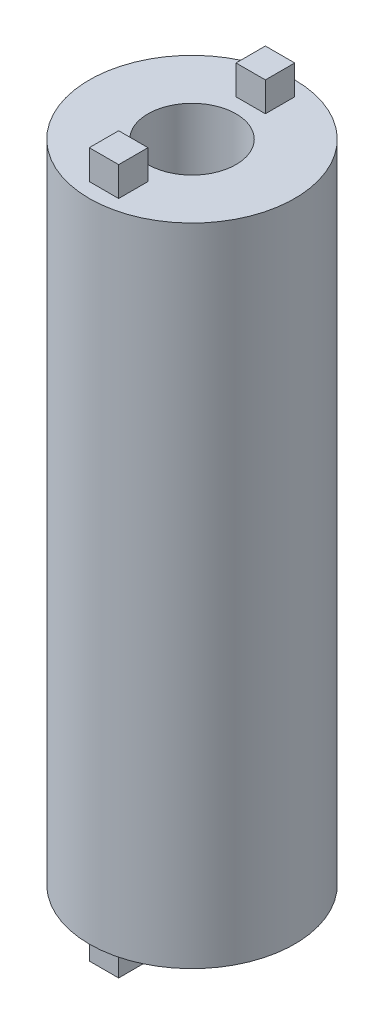
ISO-10303-21;
HEADER;
FILE_DESCRIPTION(('STEP AP214'),'2;1');
FILE_NAME('part.step','',(''),(''),'','','');
FILE_SCHEMA(('AUTOMOTIVE_DESIGN { 1 0 10303 214 1 1 1 1 }'));
ENDSEC;
DATA;
#1=APPLICATION_CONTEXT('core data for automotive mechanical design processes');
#2=APPLICATION_PROTOCOL_DEFINITION('international standard','automotive_design',2000,#1);
#3=PRODUCT_CONTEXT('',#1,'mechanical');
#4=PRODUCT('Part','Part','',(#3));
#5=PRODUCT_RELATED_PRODUCT_CATEGORY('part','',(#4));
#6=PRODUCT_DEFINITION_FORMATION('','',#4);
#7=PRODUCT_DEFINITION_CONTEXT('part definition',#1,'design');
#8=PRODUCT_DEFINITION('design','',#6,#7);
#9=PRODUCT_DEFINITION_SHAPE('','',#8);
#10=(LENGTH_UNIT() NAMED_UNIT(*) SI_UNIT(.MILLI.,.METRE.));
#11=(NAMED_UNIT(*) PLANE_ANGLE_UNIT() SI_UNIT($,.RADIAN.));
#12=(NAMED_UNIT(*) SI_UNIT($,.STERADIAN.) SOLID_ANGLE_UNIT());
#13=UNCERTAINTY_MEASURE_WITH_UNIT(LENGTH_MEASURE(1.E-05),#10,'distance_accuracy_value','');
#14=(GEOMETRIC_REPRESENTATION_CONTEXT(3) GLOBAL_UNCERTAINTY_ASSIGNED_CONTEXT((#13)) GLOBAL_UNIT_ASSIGNED_CONTEXT((#10,
#11,#12)) REPRESENTATION_CONTEXT('',''));
#15=CARTESIAN_POINT('',(0.,0.,0.));
#16=DIRECTION('',(0.,0.,1.));
#17=DIRECTION('',(1.,0.,0.));
#18=AXIS2_PLACEMENT_3D('',#15,#16,#17);
#19=CARTESIAN_POINT('',(0.,22.,0.));
#20=DIRECTION('',(0.,1.,0.));
#21=DIRECTION('',(0.,0.,1.));
#22=AXIS2_PLACEMENT_3D('',#19,#20,#21);
#23=PLANE('',#22);
#24=CARTESIAN_POINT('',(0.,22.,0.));
#25=DIRECTION('',(0.,1.,0.));
#26=DIRECTION('',(0.,0.,1.));
#27=AXIS2_PLACEMENT_3D('',#24,#25,#26);
#28=CIRCLE('',#27,3.5);
#29=CARTESIAN_POINT('',(0.,22.,3.5));
#30=VERTEX_POINT('',#29);
#31=EDGE_CURVE('E11',#30,#30,#28,.T.);
#32=ORIENTED_EDGE('',*,*,#31,.T.);
#33=EDGE_LOOP('',(#32));
#34=FACE_BOUND('',#33,.T.);
#35=CARTESIAN_POINT('',(0.,22.,0.));
#36=DIRECTION('',(0.,1.,0.));
#37=DIRECTION('',(0.,0.,1.));
#38=AXIS2_PLACEMENT_3D('',#35,#36,#37);
#39=CIRCLE('',#38,1.5);
#40=CARTESIAN_POINT('',(0.,22.,1.5));
#41=VERTEX_POINT('',#40);
#42=EDGE_CURVE('E330',#41,#41,#39,.T.);
#43=ORIENTED_EDGE('',*,*,#42,.F.);
#44=EDGE_LOOP('',(#43));
#45=FACE_BOUND('',#44,.T.);
#46=DIRECTION('',(1.,0.,0.));
#47=VECTOR('',#46,1.);
#48=CARTESIAN_POINT('',(-0.5,22.,-2.));
#49=LINE('',#48,#47);
#50=CARTESIAN_POINT('',(-0.5,22.,-2.));
#51=VERTEX_POINT('',#50);
#52=CARTESIAN_POINT('',(0.5,22.,-2.));
#53=VERTEX_POINT('',#52);
#54=EDGE_CURVE('E307',#51,#53,#49,.T.);
#55=ORIENTED_EDGE('',*,*,#54,.F.);
#56=DIRECTION('',(0.,0.,1.));
#57=VECTOR('',#56,1.);
#58=CARTESIAN_POINT('',(-0.5,22.,-3.));
#59=LINE('',#58,#57);
#60=CARTESIAN_POINT('',(-0.5,22.,-3.));
#61=VERTEX_POINT('',#60);
#62=EDGE_CURVE('E288',#61,#51,#59,.T.);
#63=ORIENTED_EDGE('',*,*,#62,.F.);
#64=DIRECTION('',(-1.,0.,0.));
#65=VECTOR('',#64,1.);
#66=CARTESIAN_POINT('',(-0.5,22.,-3.));
#67=LINE('',#66,#65);
#68=CARTESIAN_POINT('',(0.5,22.,-3.));
#69=VERTEX_POINT('',#68);
#70=EDGE_CURVE('E294',#69,#61,#67,.T.);
#71=ORIENTED_EDGE('',*,*,#70,.F.);
#72=DIRECTION('',(0.,0.,-1.));
#73=VECTOR('',#72,1.);
#74=CARTESIAN_POINT('',(0.5,22.,-3.));
#75=LINE('',#74,#73);
#76=EDGE_CURVE('E310',#53,#69,#75,.T.);
#77=ORIENTED_EDGE('',*,*,#76,.F.);
#78=EDGE_LOOP('',(#55,#63,#71,#77));
#79=FACE_BOUND('',#78,.T.);
#80=DIRECTION('',(1.,0.,0.));
#81=VECTOR('',#80,1.);
#82=CARTESIAN_POINT('',(-0.499999999999999,22.,3.));
#83=LINE('',#82,#81);
#84=CARTESIAN_POINT('',(-0.499999999999999,22.,3.));
#85=VERTEX_POINT('',#84);
#86=CARTESIAN_POINT('',(0.500000000000001,22.,3.));
#87=VERTEX_POINT('',#86);
#88=EDGE_CURVE('E266',#85,#87,#83,.T.);
#89=ORIENTED_EDGE('',*,*,#88,.F.);
#90=DIRECTION('',(0.,0.,1.));
#91=VECTOR('',#90,1.);
#92=CARTESIAN_POINT('',(-0.499999999999999,22.,2.));
#93=LINE('',#92,#91);
#94=CARTESIAN_POINT('',(-0.499999999999999,22.,2.));
#95=VERTEX_POINT('',#94);
#96=EDGE_CURVE('E247',#95,#85,#93,.T.);
#97=ORIENTED_EDGE('',*,*,#96,.F.);
#98=DIRECTION('',(-1.,0.,0.));
#99=VECTOR('',#98,1.);
#100=CARTESIAN_POINT('',(-0.499999999999999,22.,2.));
#101=LINE('',#100,#99);
#102=CARTESIAN_POINT('',(0.5,22.,2.));
#103=VERTEX_POINT('',#102);
#104=EDGE_CURVE('E253',#103,#95,#101,.T.);
#105=ORIENTED_EDGE('',*,*,#104,.F.);
#106=DIRECTION('',(0.,0.,-1.));
#107=VECTOR('',#106,1.);
#108=CARTESIAN_POINT('',(0.5,22.,2.));
#109=LINE('',#108,#107);
#110=EDGE_CURVE('E269',#87,#103,#109,.T.);
#111=ORIENTED_EDGE('',*,*,#110,.F.);
#112=EDGE_LOOP('',(#89,#97,#105,#111));
#113=FACE_BOUND('',#112,.T.);
#114=ADVANCED_FACE('F39',(#34,#45,#79,#113),#23,.T.);
#115=CARTESIAN_POINT('',(0.,0.,0.));
#116=DIRECTION('',(0.,1.,0.));
#117=DIRECTION('',(0.,0.,1.));
#118=AXIS2_PLACEMENT_3D('',#115,#116,#117);
#119=PLANE('',#118);
#120=DIRECTION('',(-1.,0.,0.));
#121=VECTOR('',#120,1.);
#122=CARTESIAN_POINT('',(-0.499999999999999,0.,2.));
#123=LINE('',#122,#121);
#124=CARTESIAN_POINT('',(0.5,0.,2.));
#125=VERTEX_POINT('',#124);
#126=CARTESIAN_POINT('',(-0.499999999999999,0.,2.));
#127=VERTEX_POINT('',#126);
#128=EDGE_CURVE('E191',#125,#127,#123,.T.);
#129=ORIENTED_EDGE('',*,*,#128,.T.);
#130=DIRECTION('',(0.,0.,1.));
#131=VECTOR('',#130,1.);
#132=CARTESIAN_POINT('',(-0.499999999999999,0.,2.));
#133=LINE('',#132,#131);
#134=CARTESIAN_POINT('',(-0.499999999999999,0.,3.));
#135=VERTEX_POINT('',#134);
#136=EDGE_CURVE('E159',#127,#135,#133,.T.);
#137=ORIENTED_EDGE('',*,*,#136,.T.);
#138=DIRECTION('',(1.,0.,0.));
#139=VECTOR('',#138,1.);
#140=CARTESIAN_POINT('',(-0.499999999999999,0.,3.));
#141=LINE('',#140,#139);
#142=CARTESIAN_POINT('',(0.500000000000001,0.,3.));
#143=VERTEX_POINT('',#142);
#144=EDGE_CURVE('E177',#135,#143,#141,.T.);
#145=ORIENTED_EDGE('',*,*,#144,.T.);
#146=DIRECTION('',(0.,0.,-1.));
#147=VECTOR('',#146,1.);
#148=CARTESIAN_POINT('',(0.5,0.,2.));
#149=LINE('',#148,#147);
#150=EDGE_CURVE('E55',#143,#125,#149,.T.);
#151=ORIENTED_EDGE('',*,*,#150,.T.);
#152=EDGE_LOOP('',(#129,#137,#145,#151));
#153=FACE_BOUND('',#152,.T.);
#154=DIRECTION('',(-1.,0.,0.));
#155=VECTOR('',#154,1.);
#156=CARTESIAN_POINT('',(-0.5,0.,-3.));
#157=LINE('',#156,#155);
#158=CARTESIAN_POINT('',(0.5,0.,-3.));
#159=VERTEX_POINT('',#158);
#160=CARTESIAN_POINT('',(-0.5,0.,-3.));
#161=VERTEX_POINT('',#160);
#162=EDGE_CURVE('E227',#159,#161,#157,.T.);
#163=ORIENTED_EDGE('',*,*,#162,.T.);
#164=DIRECTION('',(0.,0.,1.));
#165=VECTOR('',#164,1.);
#166=CARTESIAN_POINT('',(-0.5,0.,-3.));
#167=LINE('',#166,#165);
#168=CARTESIAN_POINT('',(-0.5,0.,-2.));
#169=VERTEX_POINT('',#168);
#170=EDGE_CURVE('E165',#161,#169,#167,.T.);
#171=ORIENTED_EDGE('',*,*,#170,.T.);
#172=DIRECTION('',(1.,0.,0.));
#173=VECTOR('',#172,1.);
#174=CARTESIAN_POINT('',(-0.5,0.,-2.));
#175=LINE('',#174,#173);
#176=CARTESIAN_POINT('',(0.5,0.,-2.));
#177=VERTEX_POINT('',#176);
#178=EDGE_CURVE('E211',#169,#177,#175,.T.);
#179=ORIENTED_EDGE('',*,*,#178,.T.);
#180=DIRECTION('',(0.,0.,-1.));
#181=VECTOR('',#180,1.);
#182=CARTESIAN_POINT('',(0.5,0.,-3.));
#183=LINE('',#182,#181);
#184=EDGE_CURVE('E63',#177,#159,#183,.T.);
#185=ORIENTED_EDGE('',*,*,#184,.T.);
#186=EDGE_LOOP('',(#163,#171,#179,#185));
#187=FACE_BOUND('',#186,.T.);
#188=CARTESIAN_POINT('',(0.,0.,0.));
#189=DIRECTION('',(0.,1.,0.));
#190=DIRECTION('',(0.,0.,1.));
#191=AXIS2_PLACEMENT_3D('',#188,#189,#190);
#192=CIRCLE('',#191,3.5);
#193=CARTESIAN_POINT('',(0.,0.,3.5));
#194=VERTEX_POINT('',#193);
#195=EDGE_CURVE('E43',#194,#194,#192,.T.);
#196=ORIENTED_EDGE('',*,*,#195,.F.);
#197=EDGE_LOOP('',(#196));
#198=FACE_BOUND('',#197,.T.);
#199=CARTESIAN_POINT('',(0.,0.,0.));
#200=DIRECTION('',(0.,1.,0.));
#201=DIRECTION('',(0.,0.,1.));
#202=AXIS2_PLACEMENT_3D('',#199,#200,#201);
#203=CIRCLE('',#202,1.5);
#204=CARTESIAN_POINT('',(0.,0.,1.5));
#205=VERTEX_POINT('',#204);
#206=EDGE_CURVE('E329',#205,#205,#203,.T.);
#207=ORIENTED_EDGE('',*,*,#206,.T.);
#208=EDGE_LOOP('',(#207));
#209=FACE_BOUND('',#208,.T.);
#210=ADVANCED_FACE('F338',(#153,#187,#198,#209),#119,.F.);
#211=CARTESIAN_POINT('',(0.,22.,0.));
#212=DIRECTION('',(0.,-1.,0.));
#213=DIRECTION('',(0.,0.,-1.));
#214=AXIS2_PLACEMENT_3D('',#211,#212,#213);
#215=CYLINDRICAL_SURFACE('',#214,3.5);
#216=ORIENTED_EDGE('',*,*,#31,.F.);
#217=EDGE_LOOP('',(#216));
#218=FACE_BOUND('',#217,.T.);
#219=ORIENTED_EDGE('',*,*,#195,.T.);
#220=EDGE_LOOP('',(#219));
#221=FACE_BOUND('',#220,.T.);
#222=ADVANCED_FACE('F41',(#218,#221),#215,.T.);
#223=CARTESIAN_POINT('',(0.,22.,0.));
#224=DIRECTION('',(0.,-1.,0.));
#225=DIRECTION('',(0.,0.,-1.));
#226=AXIS2_PLACEMENT_3D('',#223,#224,#225);
#227=CYLINDRICAL_SURFACE('',#226,1.5);
#228=ORIENTED_EDGE('',*,*,#42,.T.);
#229=EDGE_LOOP('',(#228));
#230=FACE_BOUND('',#229,.T.);
#231=ORIENTED_EDGE('',*,*,#206,.F.);
#232=EDGE_LOOP('',(#231));
#233=FACE_BOUND('',#232,.T.);
#234=ADVANCED_FACE('F340',(#230,#233),#227,.F.);
#235=CARTESIAN_POINT('',(-0.5,23.,-3.));
#236=DIRECTION('',(1.,0.,0.));
#237=DIRECTION('',(0.,0.,-1.));
#238=AXIS2_PLACEMENT_3D('',#235,#236,#237);
#239=PLANE('',#238);
#240=ORIENTED_EDGE('',*,*,#62,.T.);
#241=DIRECTION('',(0.,-1.,0.));
#242=VECTOR('',#241,1.);
#243=CARTESIAN_POINT('',(-0.5,23.,-2.));
#244=LINE('',#243,#242);
#245=CARTESIAN_POINT('',(-0.5,23.,-2.));
#246=VERTEX_POINT('',#245);
#247=EDGE_CURVE('E326',#246,#51,#244,.T.);
#248=ORIENTED_EDGE('',*,*,#247,.F.);
#249=DIRECTION('',(0.,0.,1.));
#250=VECTOR('',#249,1.);
#251=CARTESIAN_POINT('',(-0.5,23.,-3.));
#252=LINE('',#251,#250);
#253=CARTESIAN_POINT('',(-0.5,23.,-3.));
#254=VERTEX_POINT('',#253);
#255=EDGE_CURVE('E289',#254,#246,#252,.T.);
#256=ORIENTED_EDGE('',*,*,#255,.F.);
#257=DIRECTION('',(0.,-1.,0.));
#258=VECTOR('',#257,1.);
#259=CARTESIAN_POINT('',(-0.5,23.,-3.));
#260=LINE('',#259,#258);
#261=EDGE_CURVE('E303',#254,#61,#260,.T.);
#262=ORIENTED_EDGE('',*,*,#261,.T.);
#263=EDGE_LOOP('',(#240,#248,#256,#262));
#264=FACE_BOUND('',#263,.T.);
#265=ADVANCED_FACE('F342',(#264),#239,.F.);
#266=CARTESIAN_POINT('',(-0.5,23.,-2.));
#267=DIRECTION('',(0.,0.,-1.));
#268=DIRECTION('',(-1.,0.,0.));
#269=AXIS2_PLACEMENT_3D('',#266,#267,#268);
#270=PLANE('',#269);
#271=ORIENTED_EDGE('',*,*,#54,.T.);
#272=DIRECTION('',(0.,-1.,0.));
#273=VECTOR('',#272,1.);
#274=CARTESIAN_POINT('',(0.5,23.,-2.));
#275=LINE('',#274,#273);
#276=CARTESIAN_POINT('',(0.5,23.,-2.));
#277=VERTEX_POINT('',#276);
#278=EDGE_CURVE('E322',#277,#53,#275,.T.);
#279=ORIENTED_EDGE('',*,*,#278,.F.);
#280=DIRECTION('',(1.,0.,0.));
#281=VECTOR('',#280,1.);
#282=CARTESIAN_POINT('',(-0.5,23.,-2.));
#283=LINE('',#282,#281);
#284=EDGE_CURVE('E293',#246,#277,#283,.T.);
#285=ORIENTED_EDGE('',*,*,#284,.F.);
#286=ORIENTED_EDGE('',*,*,#247,.T.);
#287=EDGE_LOOP('',(#271,#279,#285,#286));
#288=FACE_BOUND('',#287,.T.);
#289=ADVANCED_FACE('F349',(#288),#270,.F.);
#290=CARTESIAN_POINT('',(0.5,23.,-3.));
#291=DIRECTION('',(-1.,0.,0.));
#292=DIRECTION('',(0.,0.,1.));
#293=AXIS2_PLACEMENT_3D('',#290,#291,#292);
#294=PLANE('',#293);
#295=ORIENTED_EDGE('',*,*,#76,.T.);
#296=DIRECTION('',(0.,-1.,0.));
#297=VECTOR('',#296,1.);
#298=CARTESIAN_POINT('',(0.5,23.,-3.));
#299=LINE('',#298,#297);
#300=CARTESIAN_POINT('',(0.5,23.,-3.));
#301=VERTEX_POINT('',#300);
#302=EDGE_CURVE('E319',#301,#69,#299,.T.);
#303=ORIENTED_EDGE('',*,*,#302,.F.);
#304=DIRECTION('',(0.,0.,-1.));
#305=VECTOR('',#304,1.);
#306=CARTESIAN_POINT('',(0.5,23.,-3.));
#307=LINE('',#306,#305);
#308=EDGE_CURVE('E297',#277,#301,#307,.T.);
#309=ORIENTED_EDGE('',*,*,#308,.F.);
#310=ORIENTED_EDGE('',*,*,#278,.T.);
#311=EDGE_LOOP('',(#295,#303,#309,#310));
#312=FACE_BOUND('',#311,.T.);
#313=ADVANCED_FACE('F411',(#312),#294,.F.);
#314=CARTESIAN_POINT('',(-0.5,23.,-3.));
#315=DIRECTION('',(0.,0.,1.));
#316=DIRECTION('',(1.,0.,0.));
#317=AXIS2_PLACEMENT_3D('',#314,#315,#316);
#318=PLANE('',#317);
#319=ORIENTED_EDGE('',*,*,#70,.T.);
#320=ORIENTED_EDGE('',*,*,#261,.F.);
#321=DIRECTION('',(-1.,0.,0.));
#322=VECTOR('',#321,1.);
#323=CARTESIAN_POINT('',(-0.5,23.,-3.));
#324=LINE('',#323,#322);
#325=EDGE_CURVE('E300',#301,#254,#324,.T.);
#326=ORIENTED_EDGE('',*,*,#325,.F.);
#327=ORIENTED_EDGE('',*,*,#302,.T.);
#328=EDGE_LOOP('',(#319,#320,#326,#327));
#329=FACE_BOUND('',#328,.T.);
#330=ADVANCED_FACE('F407',(#329),#318,.F.);
#331=CARTESIAN_POINT('',(0.,23.,0.));
#332=DIRECTION('',(0.,1.,0.));
#333=DIRECTION('',(0.,0.,1.));
#334=AXIS2_PLACEMENT_3D('',#331,#332,#333);
#335=PLANE('',#334);
#336=ORIENTED_EDGE('',*,*,#255,.T.);
#337=ORIENTED_EDGE('',*,*,#284,.T.);
#338=ORIENTED_EDGE('',*,*,#308,.T.);
#339=ORIENTED_EDGE('',*,*,#325,.T.);
#340=EDGE_LOOP('',(#336,#337,#338,#339));
#341=FACE_BOUND('',#340,.T.);
#342=ADVANCED_FACE('F404',(#341),#335,.T.);
#343=CARTESIAN_POINT('',(-0.499999999999999,23.,2.));
#344=DIRECTION('',(1.,0.,0.));
#345=DIRECTION('',(0.,0.,-1.));
#346=AXIS2_PLACEMENT_3D('',#343,#344,#345);
#347=PLANE('',#346);
#348=ORIENTED_EDGE('',*,*,#96,.T.);
#349=DIRECTION('',(0.,-1.,0.));
#350=VECTOR('',#349,1.);
#351=CARTESIAN_POINT('',(-0.499999999999999,23.,3.));
#352=LINE('',#351,#350);
#353=CARTESIAN_POINT('',(-0.499999999999999,23.,3.));
#354=VERTEX_POINT('',#353);
#355=EDGE_CURVE('E285',#354,#85,#352,.T.);
#356=ORIENTED_EDGE('',*,*,#355,.F.);
#357=DIRECTION('',(0.,0.,1.));
#358=VECTOR('',#357,1.);
#359=CARTESIAN_POINT('',(-0.499999999999999,23.,2.));
#360=LINE('',#359,#358);
#361=CARTESIAN_POINT('',(-0.499999999999999,23.,2.));
#362=VERTEX_POINT('',#361);
#363=EDGE_CURVE('E248',#362,#354,#360,.T.);
#364=ORIENTED_EDGE('',*,*,#363,.F.);
#365=DIRECTION('',(0.,-1.,0.));
#366=VECTOR('',#365,1.);
#367=CARTESIAN_POINT('',(-0.499999999999999,23.,2.));
#368=LINE('',#367,#366);
#369=EDGE_CURVE('E262',#362,#95,#368,.T.);
#370=ORIENTED_EDGE('',*,*,#369,.T.);
#371=EDGE_LOOP('',(#348,#356,#364,#370));
#372=FACE_BOUND('',#371,.T.);
#373=ADVANCED_FACE('F386',(#372),#347,.F.);
#374=CARTESIAN_POINT('',(-0.499999999999999,23.,3.));
#375=DIRECTION('',(0.,0.,-1.));
#376=DIRECTION('',(-1.,0.,0.));
#377=AXIS2_PLACEMENT_3D('',#374,#375,#376);
#378=PLANE('',#377);
#379=ORIENTED_EDGE('',*,*,#88,.T.);
#380=DIRECTION('',(0.,-1.,0.));
#381=VECTOR('',#380,1.);
#382=CARTESIAN_POINT('',(0.500000000000001,23.,3.));
#383=LINE('',#382,#381);
#384=CARTESIAN_POINT('',(0.500000000000001,23.,3.));
#385=VERTEX_POINT('',#384);
#386=EDGE_CURVE('E281',#385,#87,#383,.T.);
#387=ORIENTED_EDGE('',*,*,#386,.F.);
#388=DIRECTION('',(1.,0.,0.));
#389=VECTOR('',#388,1.);
#390=CARTESIAN_POINT('',(-0.499999999999999,23.,3.));
#391=LINE('',#390,#389);
#392=EDGE_CURVE('E252',#354,#385,#391,.T.);
#393=ORIENTED_EDGE('',*,*,#392,.F.);
#394=ORIENTED_EDGE('',*,*,#355,.T.);
#395=EDGE_LOOP('',(#379,#387,#393,#394));
#396=FACE_BOUND('',#395,.T.);
#397=ADVANCED_FACE('F374',(#396),#378,.F.);
#398=CARTESIAN_POINT('',(0.5,23.,2.));
#399=DIRECTION('',(-1.,0.,0.));
#400=DIRECTION('',(0.,0.,1.));
#401=AXIS2_PLACEMENT_3D('',#398,#399,#400);
#402=PLANE('',#401);
#403=ORIENTED_EDGE('',*,*,#110,.T.);
#404=DIRECTION('',(0.,-1.,0.));
#405=VECTOR('',#404,1.);
#406=CARTESIAN_POINT('',(0.5,23.,2.));
#407=LINE('',#406,#405);
#408=CARTESIAN_POINT('',(0.5,23.,2.));
#409=VERTEX_POINT('',#408);
#410=EDGE_CURVE('E278',#409,#103,#407,.T.);
#411=ORIENTED_EDGE('',*,*,#410,.F.);
#412=DIRECTION('',(0.,0.,-1.));
#413=VECTOR('',#412,1.);
#414=CARTESIAN_POINT('',(0.5,23.,2.));
#415=LINE('',#414,#413);
#416=EDGE_CURVE('E256',#385,#409,#415,.T.);
#417=ORIENTED_EDGE('',*,*,#416,.F.);
#418=ORIENTED_EDGE('',*,*,#386,.T.);
#419=EDGE_LOOP('',(#403,#411,#417,#418));
#420=FACE_BOUND('',#419,.T.);
#421=ADVANCED_FACE('F378',(#420),#402,.F.);
#422=CARTESIAN_POINT('',(-0.499999999999999,23.,2.));
#423=DIRECTION('',(0.,0.,1.));
#424=DIRECTION('',(1.,0.,0.));
#425=AXIS2_PLACEMENT_3D('',#422,#423,#424);
#426=PLANE('',#425);
#427=ORIENTED_EDGE('',*,*,#104,.T.);
#428=ORIENTED_EDGE('',*,*,#369,.F.);
#429=DIRECTION('',(-1.,0.,0.));
#430=VECTOR('',#429,1.);
#431=CARTESIAN_POINT('',(-0.499999999999999,23.,2.));
#432=LINE('',#431,#430);
#433=EDGE_CURVE('E259',#409,#362,#432,.T.);
#434=ORIENTED_EDGE('',*,*,#433,.F.);
#435=ORIENTED_EDGE('',*,*,#410,.T.);
#436=EDGE_LOOP('',(#427,#428,#434,#435));
#437=FACE_BOUND('',#436,.T.);
#438=ADVANCED_FACE('F388',(#437),#426,.F.);
#439=CARTESIAN_POINT('',(0.,23.,0.));
#440=DIRECTION('',(0.,1.,0.));
#441=DIRECTION('',(0.,0.,1.));
#442=AXIS2_PLACEMENT_3D('',#439,#440,#441);
#443=PLANE('',#442);
#444=ORIENTED_EDGE('',*,*,#363,.T.);
#445=ORIENTED_EDGE('',*,*,#392,.T.);
#446=ORIENTED_EDGE('',*,*,#416,.T.);
#447=ORIENTED_EDGE('',*,*,#433,.T.);
#448=EDGE_LOOP('',(#444,#445,#446,#447));
#449=FACE_BOUND('',#448,.T.);
#450=ADVANCED_FACE('F382',(#449),#443,.T.);
#451=CARTESIAN_POINT('',(-0.5,-1.,-3.));
#452=DIRECTION('',(-1.,0.,0.));
#453=DIRECTION('',(0.,0.,1.));
#454=AXIS2_PLACEMENT_3D('',#451,#452,#453);
#455=PLANE('',#454);
#456=ORIENTED_EDGE('',*,*,#170,.F.);
#457=DIRECTION('',(0.,1.,0.));
#458=VECTOR('',#457,1.);
#459=CARTESIAN_POINT('',(-0.5,-1.,-3.));
#460=LINE('',#459,#458);
#461=CARTESIAN_POINT('',(-0.5,-1.,-3.));
#462=VERTEX_POINT('',#461);
#463=EDGE_CURVE('E244',#462,#161,#460,.T.);
#464=ORIENTED_EDGE('',*,*,#463,.F.);
#465=DIRECTION('',(0.,0.,1.));
#466=VECTOR('',#465,1.);
#467=CARTESIAN_POINT('',(-0.5,-1.,-3.));
#468=LINE('',#467,#466);
#469=CARTESIAN_POINT('',(-0.5,-1.,-2.));
#470=VERTEX_POINT('',#469);
#471=EDGE_CURVE('E206',#462,#470,#468,.T.);
#472=ORIENTED_EDGE('',*,*,#471,.T.);
#473=DIRECTION('',(0.,1.,0.));
#474=VECTOR('',#473,1.);
#475=CARTESIAN_POINT('',(-0.5,-1.,-2.));
#476=LINE('',#475,#474);
#477=EDGE_CURVE('E223',#470,#169,#476,.T.);
#478=ORIENTED_EDGE('',*,*,#477,.T.);
#479=EDGE_LOOP('',(#456,#464,#472,#478));
#480=FACE_BOUND('',#479,.T.);
#481=ADVANCED_FACE('F395',(#480),#455,.T.);
#482=CARTESIAN_POINT('',(-0.5,-1.,-3.));
#483=DIRECTION('',(0.,0.,-1.));
#484=DIRECTION('',(-1.,0.,0.));
#485=AXIS2_PLACEMENT_3D('',#482,#483,#484);
#486=PLANE('',#485);
#487=ORIENTED_EDGE('',*,*,#162,.F.);
#488=DIRECTION('',(0.,1.,0.));
#489=VECTOR('',#488,1.);
#490=CARTESIAN_POINT('',(0.5,-1.,-3.));
#491=LINE('',#490,#489);
#492=CARTESIAN_POINT('',(0.5,-1.,-3.));
#493=VERTEX_POINT('',#492);
#494=EDGE_CURVE('E241',#493,#159,#491,.T.);
#495=ORIENTED_EDGE('',*,*,#494,.F.);
#496=DIRECTION('',(-1.,0.,0.));
#497=VECTOR('',#496,1.);
#498=CARTESIAN_POINT('',(-0.5,-1.,-3.));
#499=LINE('',#498,#497);
#500=EDGE_CURVE('E210',#493,#462,#499,.T.);
#501=ORIENTED_EDGE('',*,*,#500,.T.);
#502=ORIENTED_EDGE('',*,*,#463,.T.);
#503=EDGE_LOOP('',(#487,#495,#501,#502));
#504=FACE_BOUND('',#503,.T.);
#505=ADVANCED_FACE('F480',(#504),#486,.T.);
#506=CARTESIAN_POINT('',(0.5,-1.,-3.));
#507=DIRECTION('',(1.,0.,0.));
#508=DIRECTION('',(0.,0.,-1.));
#509=AXIS2_PLACEMENT_3D('',#506,#507,#508);
#510=PLANE('',#509);
#511=ORIENTED_EDGE('',*,*,#184,.F.);
#512=DIRECTION('',(0.,1.,0.));
#513=VECTOR('',#512,1.);
#514=CARTESIAN_POINT('',(0.5,-1.,-2.));
#515=LINE('',#514,#513);
#516=CARTESIAN_POINT('',(0.5,-1.,-2.));
#517=VERTEX_POINT('',#516);
#518=EDGE_CURVE('E238',#517,#177,#515,.T.);
#519=ORIENTED_EDGE('',*,*,#518,.F.);
#520=DIRECTION('',(0.,0.,-1.));
#521=VECTOR('',#520,1.);
#522=CARTESIAN_POINT('',(0.5,-1.,-3.));
#523=LINE('',#522,#521);
#524=EDGE_CURVE('E215',#517,#493,#523,.T.);
#525=ORIENTED_EDGE('',*,*,#524,.T.);
#526=ORIENTED_EDGE('',*,*,#494,.T.);
#527=EDGE_LOOP('',(#511,#519,#525,#526));
#528=FACE_BOUND('',#527,.T.);
#529=ADVANCED_FACE('F489',(#528),#510,.T.);
#530=CARTESIAN_POINT('',(-0.5,-1.,-2.));
#531=DIRECTION('',(0.,0.,1.));
#532=DIRECTION('',(1.,0.,0.));
#533=AXIS2_PLACEMENT_3D('',#530,#531,#532);
#534=PLANE('',#533);
#535=ORIENTED_EDGE('',*,*,#178,.F.);
#536=ORIENTED_EDGE('',*,*,#477,.F.);
#537=DIRECTION('',(1.,0.,0.));
#538=VECTOR('',#537,1.);
#539=CARTESIAN_POINT('',(-0.5,-1.,-2.));
#540=LINE('',#539,#538);
#541=EDGE_CURVE('E219',#470,#517,#540,.T.);
#542=ORIENTED_EDGE('',*,*,#541,.T.);
#543=ORIENTED_EDGE('',*,*,#518,.T.);
#544=EDGE_LOOP('',(#535,#536,#542,#543));
#545=FACE_BOUND('',#544,.T.);
#546=ADVANCED_FACE('F499',(#545),#534,.T.);
#547=CARTESIAN_POINT('',(0.,-1.,0.));
#548=DIRECTION('',(0.,-1.,0.));
#549=DIRECTION('',(0.,0.,1.));
#550=AXIS2_PLACEMENT_3D('',#547,#548,#549);
#551=PLANE('',#550);
#552=ORIENTED_EDGE('',*,*,#471,.F.);
#553=ORIENTED_EDGE('',*,*,#500,.F.);
#554=ORIENTED_EDGE('',*,*,#524,.F.);
#555=ORIENTED_EDGE('',*,*,#541,.F.);
#556=EDGE_LOOP('',(#552,#553,#554,#555));
#557=FACE_BOUND('',#556,.T.);
#558=ADVANCED_FACE('F508',(#557),#551,.T.);
#559=CARTESIAN_POINT('',(-0.499999999999999,-1.,2.));
#560=DIRECTION('',(-1.,0.,0.));
#561=DIRECTION('',(0.,0.,1.));
#562=AXIS2_PLACEMENT_3D('',#559,#560,#561);
#563=PLANE('',#562);
#564=ORIENTED_EDGE('',*,*,#136,.F.);
#565=DIRECTION('',(0.,1.,0.));
#566=VECTOR('',#565,1.);
#567=CARTESIAN_POINT('',(-0.499999999999999,-1.,2.));
#568=LINE('',#567,#566);
#569=CARTESIAN_POINT('',(-0.499999999999999,-1.,2.));
#570=VERTEX_POINT('',#569);
#571=EDGE_CURVE('E153',#570,#127,#568,.T.);
#572=ORIENTED_EDGE('',*,*,#571,.F.);
#573=DIRECTION('',(0.,0.,1.));
#574=VECTOR('',#573,1.);
#575=CARTESIAN_POINT('',(-0.499999999999999,-1.,2.));
#576=LINE('',#575,#574);
#577=CARTESIAN_POINT('',(-0.499999999999999,-1.,3.));
#578=VERTEX_POINT('',#577);
#579=EDGE_CURVE('E156',#570,#578,#576,.T.);
#580=ORIENTED_EDGE('',*,*,#579,.T.);
#581=DIRECTION('',(0.,1.,0.));
#582=VECTOR('',#581,1.);
#583=CARTESIAN_POINT('',(-0.499999999999999,-1.,3.));
#584=LINE('',#583,#582);
#585=EDGE_CURVE('E188',#578,#135,#584,.T.);
#586=ORIENTED_EDGE('',*,*,#585,.T.);
#587=EDGE_LOOP('',(#564,#572,#580,#586));
#588=FACE_BOUND('',#587,.T.);
#589=ADVANCED_FACE('F155',(#588),#563,.T.);
#590=CARTESIAN_POINT('',(-0.499999999999999,-1.,2.));
#591=DIRECTION('',(0.,0.,-1.));
#592=DIRECTION('',(-1.,0.,0.));
#593=AXIS2_PLACEMENT_3D('',#590,#591,#592);
#594=PLANE('',#593);
#595=ORIENTED_EDGE('',*,*,#128,.F.);
#596=DIRECTION('',(0.,1.,0.));
#597=VECTOR('',#596,1.);
#598=CARTESIAN_POINT('',(0.5,-1.,2.));
#599=LINE('',#598,#597);
#600=CARTESIAN_POINT('',(0.5,-1.,2.));
#601=VERTEX_POINT('',#600);
#602=EDGE_CURVE('E166',#601,#125,#599,.T.);
#603=ORIENTED_EDGE('',*,*,#602,.F.);
#604=DIRECTION('',(-1.,0.,0.));
#605=VECTOR('',#604,1.);
#606=CARTESIAN_POINT('',(-0.499999999999999,-1.,2.));
#607=LINE('',#606,#605);
#608=EDGE_CURVE('E172',#601,#570,#607,.T.);
#609=ORIENTED_EDGE('',*,*,#608,.T.);
#610=ORIENTED_EDGE('',*,*,#571,.T.);
#611=EDGE_LOOP('',(#595,#603,#609,#610));
#612=FACE_BOUND('',#611,.T.);
#613=ADVANCED_FACE('F179',(#612),#594,.T.);
#614=CARTESIAN_POINT('',(0.5,-1.,2.));
#615=DIRECTION('',(1.,0.,0.));
#616=DIRECTION('',(0.,0.,-1.));
#617=AXIS2_PLACEMENT_3D('',#614,#615,#616);
#618=PLANE('',#617);
#619=ORIENTED_EDGE('',*,*,#150,.F.);
#620=DIRECTION('',(0.,1.,0.));
#621=VECTOR('',#620,1.);
#622=CARTESIAN_POINT('',(0.500000000000001,-1.,3.));
#623=LINE('',#622,#621);
#624=CARTESIAN_POINT('',(0.500000000000001,-1.,3.));
#625=VERTEX_POINT('',#624);
#626=EDGE_CURVE('E201',#625,#143,#623,.T.);
#627=ORIENTED_EDGE('',*,*,#626,.F.);
#628=DIRECTION('',(0.,0.,-1.));
#629=VECTOR('',#628,1.);
#630=CARTESIAN_POINT('',(0.5,-1.,2.));
#631=LINE('',#630,#629);
#632=EDGE_CURVE('E181',#625,#601,#631,.T.);
#633=ORIENTED_EDGE('',*,*,#632,.T.);
#634=ORIENTED_EDGE('',*,*,#602,.T.);
#635=EDGE_LOOP('',(#619,#627,#633,#634));
#636=FACE_BOUND('',#635,.T.);
#637=ADVANCED_FACE('F535',(#636),#618,.T.);
#638=CARTESIAN_POINT('',(-0.499999999999999,-1.,3.));
#639=DIRECTION('',(0.,0.,1.));
#640=DIRECTION('',(1.,0.,0.));
#641=AXIS2_PLACEMENT_3D('',#638,#639,#640);
#642=PLANE('',#641);
#643=ORIENTED_EDGE('',*,*,#144,.F.);
#644=ORIENTED_EDGE('',*,*,#585,.F.);
#645=DIRECTION('',(1.,0.,0.));
#646=VECTOR('',#645,1.);
#647=CARTESIAN_POINT('',(-0.499999999999999,-1.,3.));
#648=LINE('',#647,#646);
#649=EDGE_CURVE('E175',#578,#625,#648,.T.);
#650=ORIENTED_EDGE('',*,*,#649,.T.);
#651=ORIENTED_EDGE('',*,*,#626,.T.);
#652=EDGE_LOOP('',(#643,#644,#650,#651));
#653=FACE_BOUND('',#652,.T.);
#654=ADVANCED_FACE('F544',(#653),#642,.T.);
#655=CARTESIAN_POINT('',(0.,-1.,0.));
#656=DIRECTION('',(0.,-1.,0.));
#657=DIRECTION('',(0.,0.,1.));
#658=AXIS2_PLACEMENT_3D('',#655,#656,#657);
#659=PLANE('',#658);
#660=ORIENTED_EDGE('',*,*,#579,.F.);
#661=ORIENTED_EDGE('',*,*,#608,.F.);
#662=ORIENTED_EDGE('',*,*,#632,.F.);
#663=ORIENTED_EDGE('',*,*,#649,.F.);
#664=EDGE_LOOP('',(#660,#661,#662,#663));
#665=FACE_BOUND('',#664,.T.);
#666=ADVANCED_FACE('F170',(#665),#659,.T.);
#667=CLOSED_SHELL('',(#114,#210,#222,#234,#265,#289,#313,#330,#342,#373,#397,#421,#438,#450,
#481,#505,#529,#546,#558,#589,#613,#637,#654,#666));
#668=MANIFOLD_SOLID_BREP('B2',#667);
#669=ADVANCED_BREP_SHAPE_REPRESENTATION('',(#18,#668),#14);
#670=SHAPE_DEFINITION_REPRESENTATION(#9,#669);
ENDSEC;
END-ISO-10303-21;
